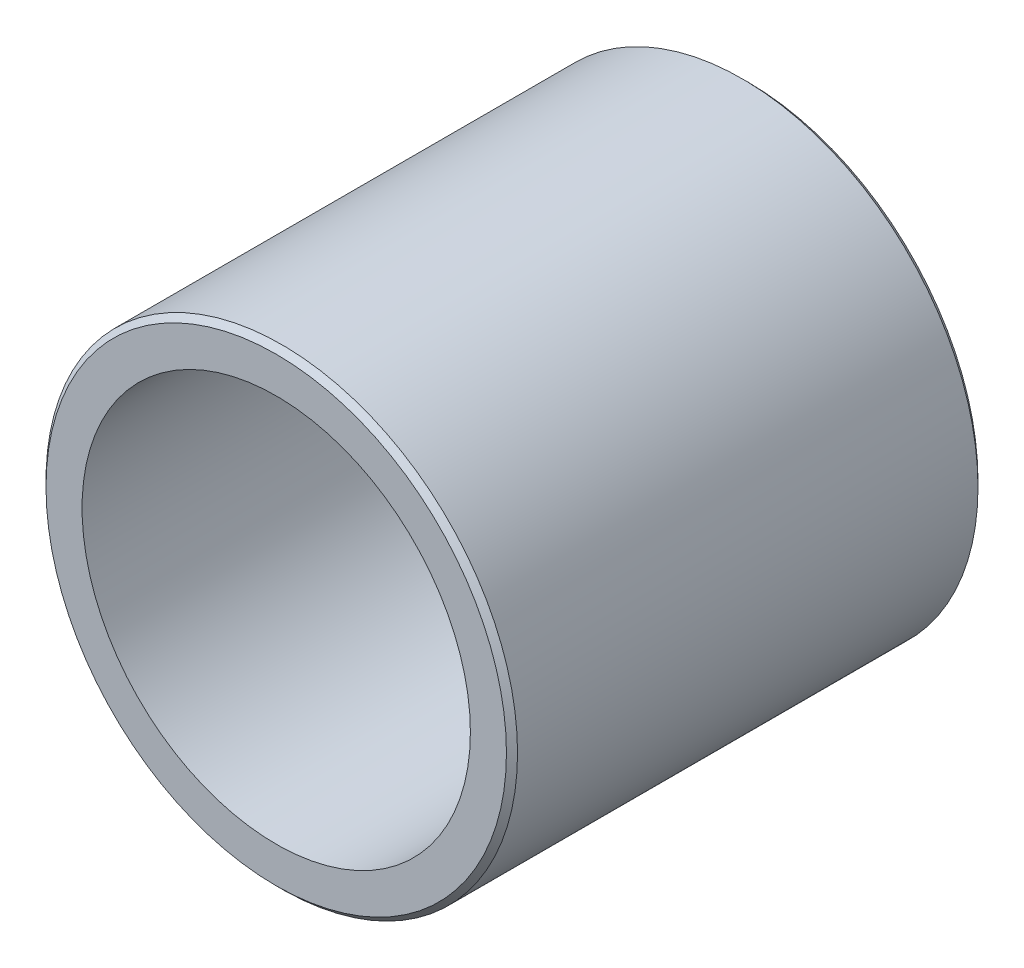
ISO-10303-21;
HEADER;
FILE_DESCRIPTION(('STEP AP214'),'2;1');
FILE_NAME('part.step','',(''),(''),'','','');
FILE_SCHEMA(('AUTOMOTIVE_DESIGN { 1 0 10303 214 1 1 1 1 }'));
ENDSEC;
DATA;
#1=APPLICATION_CONTEXT('core data for automotive mechanical design processes');
#2=APPLICATION_PROTOCOL_DEFINITION('international standard','automotive_design',2000,#1);
#3=PRODUCT_CONTEXT('',#1,'mechanical');
#4=PRODUCT('Part','Part','',(#3));
#5=PRODUCT_RELATED_PRODUCT_CATEGORY('part','',(#4));
#6=PRODUCT_DEFINITION_FORMATION('','',#4);
#7=PRODUCT_DEFINITION_CONTEXT('part definition',#1,'design');
#8=PRODUCT_DEFINITION('design','',#6,#7);
#9=PRODUCT_DEFINITION_SHAPE('','',#8);
#10=(LENGTH_UNIT() NAMED_UNIT(*) SI_UNIT(.MILLI.,.METRE.));
#11=(NAMED_UNIT(*) PLANE_ANGLE_UNIT() SI_UNIT($,.RADIAN.));
#12=(NAMED_UNIT(*) SI_UNIT($,.STERADIAN.) SOLID_ANGLE_UNIT());
#13=UNCERTAINTY_MEASURE_WITH_UNIT(LENGTH_MEASURE(1.E-05),#10,'distance_accuracy_value','');
#14=(GEOMETRIC_REPRESENTATION_CONTEXT(3) GLOBAL_UNCERTAINTY_ASSIGNED_CONTEXT((#13)) GLOBAL_UNIT_ASSIGNED_CONTEXT((#10,
#11,#12)) REPRESENTATION_CONTEXT('',''));
#15=CARTESIAN_POINT('',(0.,0.,0.));
#16=DIRECTION('',(0.,0.,1.));
#17=DIRECTION('',(1.,0.,0.));
#18=AXIS2_PLACEMENT_3D('',#15,#16,#17);
#19=CARTESIAN_POINT('',(0.,0.,53.975));
#20=DIRECTION('',(0.,0.,1.));
#21=DIRECTION('',(1.,0.,0.));
#22=AXIS2_PLACEMENT_3D('',#19,#20,#21);
#23=PLANE('',#22);
#24=CARTESIAN_POINT('',(0.,0.,53.975));
#25=DIRECTION('',(0.,0.,1.));
#26=DIRECTION('',(1.,0.,0.));
#27=AXIS2_PLACEMENT_3D('',#24,#25,#26);
#28=CIRCLE('',#27,52.705);
#29=CARTESIAN_POINT('',(52.705,0.,53.975));
#30=VERTEX_POINT('',#29);
#31=EDGE_CURVE('E62',#30,#30,#28,.T.);
#32=ORIENTED_EDGE('',*,*,#31,.T.);
#33=EDGE_LOOP('',(#32));
#34=FACE_BOUND('',#33,.T.);
#35=CARTESIAN_POINT('',(0.,0.,53.975));
#36=DIRECTION('',(0.,0.,1.));
#37=DIRECTION('',(1.,0.,0.));
#38=AXIS2_PLACEMENT_3D('',#35,#36,#37);
#39=CIRCLE('',#38,44.45);
#40=CARTESIAN_POINT('',(44.45,0.,53.975));
#41=VERTEX_POINT('',#40);
#42=EDGE_CURVE('E68',#41,#41,#39,.T.);
#43=ORIENTED_EDGE('',*,*,#42,.F.);
#44=EDGE_LOOP('',(#43));
#45=FACE_BOUND('',#44,.T.);
#46=ADVANCED_FACE('F43',(#34,#45),#23,.T.);
#47=CARTESIAN_POINT('',(0.,0.,-53.975));
#48=DIRECTION('',(0.,0.,1.));
#49=DIRECTION('',(1.,0.,0.));
#50=AXIS2_PLACEMENT_3D('',#47,#48,#49);
#51=PLANE('',#50);
#52=CARTESIAN_POINT('',(0.,0.,-53.975));
#53=DIRECTION('',(0.,0.,1.));
#54=DIRECTION('',(1.,0.,0.));
#55=AXIS2_PLACEMENT_3D('',#52,#53,#54);
#56=CIRCLE('',#55,52.705);
#57=CARTESIAN_POINT('',(52.705,0.,-53.975));
#58=VERTEX_POINT('',#57);
#59=EDGE_CURVE('E10',#58,#58,#56,.F.);
#60=ORIENTED_EDGE('',*,*,#59,.T.);
#61=EDGE_LOOP('',(#60));
#62=FACE_BOUND('',#61,.T.);
#63=CARTESIAN_POINT('',(0.,0.,-53.975));
#64=DIRECTION('',(0.,0.,1.));
#65=DIRECTION('',(1.,0.,0.));
#66=AXIS2_PLACEMENT_3D('',#63,#64,#65);
#67=CIRCLE('',#66,44.45);
#68=CARTESIAN_POINT('',(44.45,0.,-53.975));
#69=VERTEX_POINT('',#68);
#70=EDGE_CURVE('E69',#69,#69,#67,.T.);
#71=ORIENTED_EDGE('',*,*,#70,.T.);
#72=EDGE_LOOP('',(#71));
#73=FACE_BOUND('',#72,.T.);
#74=ADVANCED_FACE('F81',(#62,#73),#51,.F.);
#75=CARTESIAN_POINT('',(0.,0.,53.975));
#76=DIRECTION('',(0.,0.,-1.));
#77=DIRECTION('',(-1.,0.,0.));
#78=AXIS2_PLACEMENT_3D('',#75,#76,#77);
#79=CYLINDRICAL_SURFACE('',#78,53.975);
#80=CARTESIAN_POINT('',(0.,0.,52.705));
#81=DIRECTION('',(0.,0.,1.));
#82=DIRECTION('',(1.,0.,0.));
#83=AXIS2_PLACEMENT_3D('',#80,#81,#82);
#84=CIRCLE('',#83,53.975);
#85=CARTESIAN_POINT('',(53.975,0.,52.705));
#86=VERTEX_POINT('',#85);
#87=EDGE_CURVE('E52',#86,#86,#84,.F.);
#88=ORIENTED_EDGE('',*,*,#87,.T.);
#89=EDGE_LOOP('',(#88));
#90=FACE_BOUND('',#89,.T.);
#91=CARTESIAN_POINT('',(0.,0.,-52.705));
#92=DIRECTION('',(0.,0.,1.));
#93=DIRECTION('',(1.,0.,0.));
#94=AXIS2_PLACEMENT_3D('',#91,#92,#93);
#95=CIRCLE('',#94,53.975);
#96=CARTESIAN_POINT('',(53.975,0.,-52.705));
#97=VERTEX_POINT('',#96);
#98=EDGE_CURVE('E57',#97,#97,#95,.T.);
#99=ORIENTED_EDGE('',*,*,#98,.T.);
#100=EDGE_LOOP('',(#99));
#101=FACE_BOUND('',#100,.T.);
#102=ADVANCED_FACE('F87',(#90,#101),#79,.T.);
#103=CARTESIAN_POINT('',(0.,0.,53.975));
#104=DIRECTION('',(0.,0.,-1.));
#105=DIRECTION('',(-1.,0.,0.));
#106=AXIS2_PLACEMENT_3D('',#103,#104,#105);
#107=CYLINDRICAL_SURFACE('',#106,44.45);
#108=ORIENTED_EDGE('',*,*,#42,.T.);
#109=EDGE_LOOP('',(#108));
#110=FACE_BOUND('',#109,.T.);
#111=ORIENTED_EDGE('',*,*,#70,.F.);
#112=EDGE_LOOP('',(#111));
#113=FACE_BOUND('',#112,.T.);
#114=ADVANCED_FACE('F77',(#110,#113),#107,.F.);
#115=CARTESIAN_POINT('',(0.,0.,53.975));
#116=DIRECTION('',(0.,0.,-1.));
#117=DIRECTION('',(-1.,0.,0.));
#118=AXIS2_PLACEMENT_3D('',#115,#116,#117);
#119=CONICAL_SURFACE('',#118,52.705,0.785398163397448);
#120=ORIENTED_EDGE('',*,*,#87,.F.);
#121=EDGE_LOOP('',(#120));
#122=FACE_BOUND('',#121,.T.);
#123=ORIENTED_EDGE('',*,*,#31,.F.);
#124=EDGE_LOOP('',(#123));
#125=FACE_BOUND('',#124,.T.);
#126=ADVANCED_FACE('F93',(#122,#125),#119,.T.);
#127=CARTESIAN_POINT('',(0.,0.,-52.705));
#128=DIRECTION('',(0.,0.,1.));
#129=DIRECTION('',(1.,0.,0.));
#130=AXIS2_PLACEMENT_3D('',#127,#128,#129);
#131=CONICAL_SURFACE('',#130,53.975,0.785398163397456);
#132=ORIENTED_EDGE('',*,*,#59,.F.);
#133=EDGE_LOOP('',(#132));
#134=FACE_BOUND('',#133,.T.);
#135=ORIENTED_EDGE('',*,*,#98,.F.);
#136=EDGE_LOOP('',(#135));
#137=FACE_BOUND('',#136,.T.);
#138=ADVANCED_FACE('F46',(#134,#137),#131,.T.);
#139=CLOSED_SHELL('',(#46,#74,#102,#114,#126,#138));
#140=MANIFOLD_SOLID_BREP('B2',#139);
#141=ADVANCED_BREP_SHAPE_REPRESENTATION('',(#18,#140),#14);
#142=SHAPE_DEFINITION_REPRESENTATION(#9,#141);
ENDSEC;
END-ISO-10303-21;
